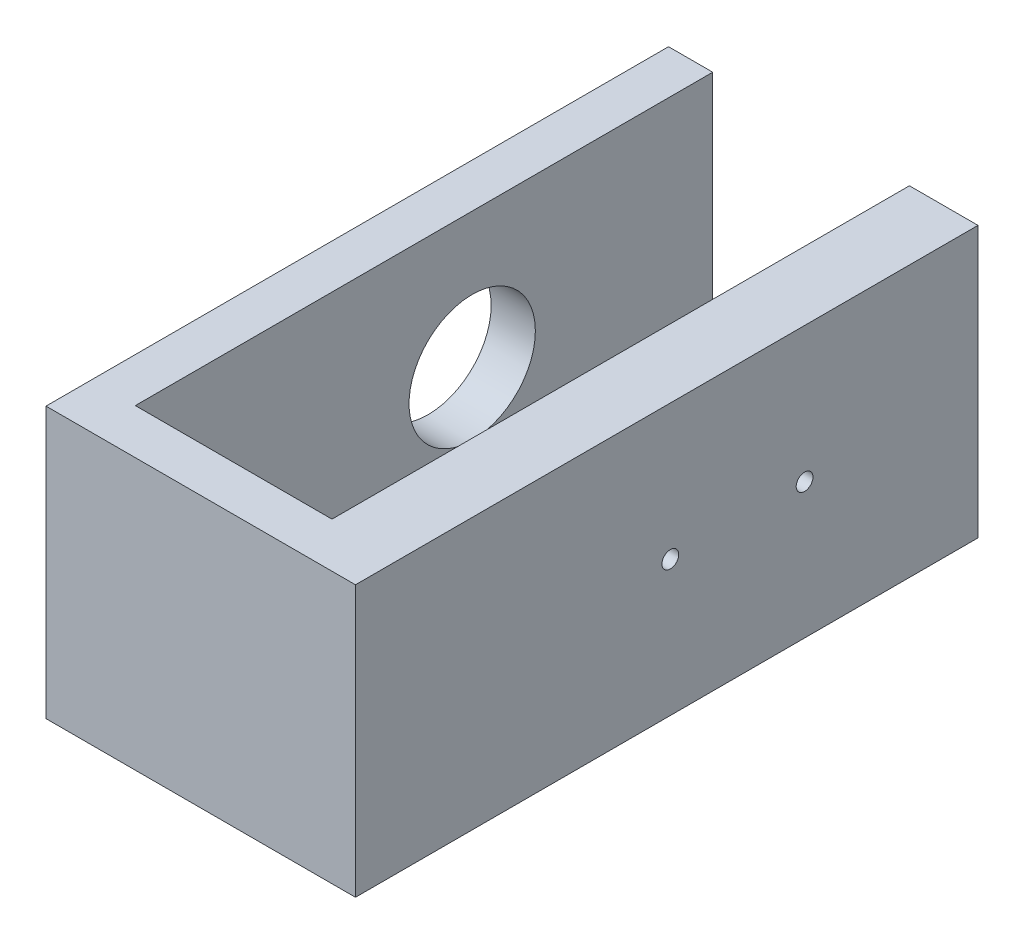
ISO-10303-21;
HEADER;
FILE_DESCRIPTION(('STEP AP214'),'2;1');
FILE_NAME('part.step','',(''),(''),'','','');
FILE_SCHEMA(('AUTOMOTIVE_DESIGN { 1 0 10303 214 1 1 1 1 }'));
ENDSEC;
DATA;
#1=APPLICATION_CONTEXT('core data for automotive mechanical design processes');
#2=APPLICATION_PROTOCOL_DEFINITION('international standard','automotive_design',2000,#1);
#3=PRODUCT_CONTEXT('',#1,'mechanical');
#4=PRODUCT('Part','Part','',(#3));
#5=PRODUCT_RELATED_PRODUCT_CATEGORY('part','',(#4));
#6=PRODUCT_DEFINITION_FORMATION('','',#4);
#7=PRODUCT_DEFINITION_CONTEXT('part definition',#1,'design');
#8=PRODUCT_DEFINITION('design','',#6,#7);
#9=PRODUCT_DEFINITION_SHAPE('','',#8);
#10=(LENGTH_UNIT() NAMED_UNIT(*) SI_UNIT(.MILLI.,.METRE.));
#11=(NAMED_UNIT(*) PLANE_ANGLE_UNIT() SI_UNIT($,.RADIAN.));
#12=(NAMED_UNIT(*) SI_UNIT($,.STERADIAN.) SOLID_ANGLE_UNIT());
#13=UNCERTAINTY_MEASURE_WITH_UNIT(LENGTH_MEASURE(1.E-05),#10,'distance_accuracy_value','');
#14=(GEOMETRIC_REPRESENTATION_CONTEXT(3) GLOBAL_UNCERTAINTY_ASSIGNED_CONTEXT((#13)) GLOBAL_UNIT_ASSIGNED_CONTEXT((#10,
#11,#12)) REPRESENTATION_CONTEXT('',''));
#15=CARTESIAN_POINT('',(0.,0.,0.));
#16=DIRECTION('',(0.,0.,1.));
#17=DIRECTION('',(1.,0.,0.));
#18=AXIS2_PLACEMENT_3D('',#15,#16,#17);
#19=CARTESIAN_POINT('',(-20.,15.,-48.34));
#20=DIRECTION('',(1.,0.,0.));
#21=DIRECTION('',(0.,0.,-1.));
#22=AXIS2_PLACEMENT_3D('',#19,#20,#21);
#23=CYLINDRICAL_SURFACE('',#22,7.);
#24=CARTESIAN_POINT('',(41.6,15.,-48.34));
#25=DIRECTION('',(1.,0.,0.));
#26=DIRECTION('',(0.,0.,-1.));
#27=AXIS2_PLACEMENT_3D('',#24,#25,#26);
#28=CIRCLE('',#27,7.);
#29=CARTESIAN_POINT('',(41.6,15.,-55.34));
#30=VERTEX_POINT('',#29);
#31=EDGE_CURVE('E196',#30,#30,#28,.T.);
#32=ORIENTED_EDGE('',*,*,#31,.F.);
#33=EDGE_LOOP('',(#32));
#34=FACE_BOUND('',#33,.T.);
#35=CARTESIAN_POINT('',(45.2,15.,-48.34));
#36=DIRECTION('',(1.,0.,0.));
#37=DIRECTION('',(0.,0.,-1.));
#38=AXIS2_PLACEMENT_3D('',#35,#36,#37);
#39=CIRCLE('',#38,7.);
#40=CARTESIAN_POINT('',(45.2,14.2065492031291,-55.2948857526882));
#41=VERTEX_POINT('',#40);
#42=CARTESIAN_POINT('',(45.2,15.7934507968709,-55.2948857526882));
#43=VERTEX_POINT('',#42);
#44=EDGE_CURVE('E149',#41,#43,#39,.T.);
#45=ORIENTED_EDGE('',*,*,#44,.T.);
#46=DIRECTION('',(-1.,0.,0.));
#47=VECTOR('',#46,1.);
#48=CARTESIAN_POINT('',(45.2,15.7934507968709,-55.2948857526882));
#49=LINE('',#48,#47);
#50=CARTESIAN_POINT('',(45.4,15.7934507968709,-55.2948857526882));
#51=VERTEX_POINT('',#50);
#52=EDGE_CURVE('E139',#51,#43,#49,.T.);
#53=ORIENTED_EDGE('',*,*,#52,.F.);
#54=CARTESIAN_POINT('',(45.4,15.,-48.34));
#55=DIRECTION('',(-1.,0.,0.));
#56=DIRECTION('',(0.,0.,1.));
#57=AXIS2_PLACEMENT_3D('',#54,#55,#56);
#58=CIRCLE('',#57,7.);
#59=CARTESIAN_POINT('',(45.4,15.793450796871,-41.3851142473118));
#60=VERTEX_POINT('',#59);
#61=EDGE_CURVE('E133',#60,#51,#58,.T.);
#62=ORIENTED_EDGE('',*,*,#61,.F.);
#63=DIRECTION('',(-1.,0.,0.));
#64=VECTOR('',#63,1.);
#65=CARTESIAN_POINT('',(45.2,15.793450796871,-41.3851142473118));
#66=LINE('',#65,#64);
#67=CARTESIAN_POINT('',(45.2,15.793450796871,-41.3851142473118));
#68=VERTEX_POINT('',#67);
#69=EDGE_CURVE('E64',#68,#60,#66,.F.);
#70=ORIENTED_EDGE('',*,*,#69,.F.);
#71=CARTESIAN_POINT('',(45.2,15.,-48.34));
#72=DIRECTION('',(1.,0.,0.));
#73=DIRECTION('',(0.,0.,-1.));
#74=AXIS2_PLACEMENT_3D('',#71,#72,#73);
#75=CIRCLE('',#74,7.);
#76=CARTESIAN_POINT('',(45.2,14.2065492031291,-41.3851142473118));
#77=VERTEX_POINT('',#76);
#78=EDGE_CURVE('E50',#68,#77,#75,.T.);
#79=ORIENTED_EDGE('',*,*,#78,.T.);
#80=DIRECTION('',(-1.,0.,0.));
#81=VECTOR('',#80,1.);
#82=CARTESIAN_POINT('',(45.2,14.2065492031291,-41.3851142473118));
#83=LINE('',#82,#81);
#84=CARTESIAN_POINT('',(45.4,14.2065492031291,-41.3851142473118));
#85=VERTEX_POINT('',#84);
#86=EDGE_CURVE('E141',#85,#77,#83,.T.);
#87=ORIENTED_EDGE('',*,*,#86,.F.);
#88=CARTESIAN_POINT('',(45.4,14.2065492031291,-55.2948857526882));
#89=VERTEX_POINT('',#88);
#90=EDGE_CURVE('E135',#89,#85,#58,.T.);
#91=ORIENTED_EDGE('',*,*,#90,.F.);
#92=DIRECTION('',(-1.,0.,0.));
#93=VECTOR('',#92,1.);
#94=CARTESIAN_POINT('',(45.2,14.2065492031291,-55.2948857526882));
#95=LINE('',#94,#93);
#96=EDGE_CURVE('E57',#41,#89,#95,.F.);
#97=ORIENTED_EDGE('',*,*,#96,.F.);
#98=EDGE_LOOP('',(#45,#53,#62,#70,#79,#87,#91,#97));
#99=FACE_BOUND('',#98,.T.);
#100=ADVANCED_FACE('F41',(#34,#99),#23,.F.);
#101=CARTESIAN_POINT('',(0.,30.,0.));
#102=DIRECTION('',(0.,1.,0.));
#103=DIRECTION('',(0.,0.,1.));
#104=AXIS2_PLACEMENT_3D('',#101,#102,#103);
#105=PLANE('',#104);
#106=DIRECTION('',(1.,0.,0.));
#107=VECTOR('',#106,1.);
#108=CARTESIAN_POINT('',(0.,30.,-75.));
#109=LINE('',#108,#107);
#110=CARTESIAN_POINT('',(14.9,30.,-75.));
#111=VERTEX_POINT('',#110);
#112=CARTESIAN_POINT('',(19.8,30.,-75.));
#113=VERTEX_POINT('',#112);
#114=EDGE_CURVE('E186',#111,#113,#109,.T.);
#115=ORIENTED_EDGE('',*,*,#114,.F.);
#116=DIRECTION('',(0.,0.,1.));
#117=VECTOR('',#116,1.);
#118=CARTESIAN_POINT('',(14.9,30.,0.));
#119=LINE('',#118,#117);
#120=CARTESIAN_POINT('',(14.9,30.,-6.));
#121=VERTEX_POINT('',#120);
#122=EDGE_CURVE('E261',#111,#121,#119,.T.);
#123=ORIENTED_EDGE('',*,*,#122,.T.);
#124=DIRECTION('',(1.,0.,0.));
#125=VECTOR('',#124,1.);
#126=CARTESIAN_POINT('',(0.,30.,-6.));
#127=LINE('',#126,#125);
#128=CARTESIAN_POINT('',(49.2,30.,-6.));
#129=VERTEX_POINT('',#128);
#130=EDGE_CURVE('E207',#121,#129,#127,.T.);
#131=ORIENTED_EDGE('',*,*,#130,.T.);
#132=DIRECTION('',(0.,0.,-1.));
#133=VECTOR('',#132,1.);
#134=CARTESIAN_POINT('',(49.2,30.,0.));
#135=LINE('',#134,#133);
#136=CARTESIAN_POINT('',(49.2,30.,-75.));
#137=VERTEX_POINT('',#136);
#138=EDGE_CURVE('E204',#129,#137,#135,.T.);
#139=ORIENTED_EDGE('',*,*,#138,.T.);
#140=DIRECTION('',(-1.,0.,0.));
#141=VECTOR('',#140,1.);
#142=CARTESIAN_POINT('',(0.,30.,-75.));
#143=LINE('',#142,#141);
#144=CARTESIAN_POINT('',(41.6,30.,-75.));
#145=VERTEX_POINT('',#144);
#146=EDGE_CURVE('E192',#137,#145,#143,.T.);
#147=ORIENTED_EDGE('',*,*,#146,.T.);
#148=DIRECTION('',(0.,0.,-1.));
#149=VECTOR('',#148,1.);
#150=CARTESIAN_POINT('',(41.6,30.,-75.));
#151=LINE('',#150,#149);
#152=CARTESIAN_POINT('',(41.6,30.,-11.));
#153=VERTEX_POINT('',#152);
#154=EDGE_CURVE('E215',#153,#145,#151,.T.);
#155=ORIENTED_EDGE('',*,*,#154,.F.);
#156=DIRECTION('',(1.,0.,0.));
#157=VECTOR('',#156,1.);
#158=CARTESIAN_POINT('',(41.6,30.,-11.));
#159=LINE('',#158,#157);
#160=CARTESIAN_POINT('',(19.8,30.,-11.));
#161=VERTEX_POINT('',#160);
#162=EDGE_CURVE('E230',#161,#153,#159,.T.);
#163=ORIENTED_EDGE('',*,*,#162,.F.);
#164=DIRECTION('',(0.,0.,1.));
#165=VECTOR('',#164,1.);
#166=CARTESIAN_POINT('',(19.8,30.,-75.));
#167=LINE('',#166,#165);
#168=EDGE_CURVE('E251',#113,#161,#167,.T.);
#169=ORIENTED_EDGE('',*,*,#168,.F.);
#170=EDGE_LOOP('',(#115,#123,#131,#139,#147,#155,#163,#169));
#171=FACE_BOUND('',#170,.T.);
#172=ADVANCED_FACE('F43',(#171),#105,.T.);
#173=CARTESIAN_POINT('',(0.,0.,0.));
#174=DIRECTION('',(0.,1.,0.));
#175=DIRECTION('',(0.,0.,1.));
#176=AXIS2_PLACEMENT_3D('',#173,#174,#175);
#177=PLANE('',#176);
#178=DIRECTION('',(0.,0.,1.));
#179=VECTOR('',#178,1.);
#180=CARTESIAN_POINT('',(14.9,0.,0.));
#181=LINE('',#180,#179);
#182=CARTESIAN_POINT('',(14.9,0.,-75.));
#183=VERTEX_POINT('',#182);
#184=CARTESIAN_POINT('',(14.9,0.,-6.));
#185=VERTEX_POINT('',#184);
#186=EDGE_CURVE('E246',#183,#185,#181,.T.);
#187=ORIENTED_EDGE('',*,*,#186,.F.);
#188=DIRECTION('',(1.,0.,0.));
#189=VECTOR('',#188,1.);
#190=CARTESIAN_POINT('',(0.,0.,-75.));
#191=LINE('',#190,#189);
#192=CARTESIAN_POINT('',(19.8,0.,-75.));
#193=VERTEX_POINT('',#192);
#194=EDGE_CURVE('E188',#183,#193,#191,.T.);
#195=ORIENTED_EDGE('',*,*,#194,.T.);
#196=DIRECTION('',(0.,0.,-1.));
#197=VECTOR('',#196,1.);
#198=CARTESIAN_POINT('',(19.8,0.,-75.));
#199=LINE('',#198,#197);
#200=CARTESIAN_POINT('',(19.8,0.,-11.));
#201=VERTEX_POINT('',#200);
#202=EDGE_CURVE('E242',#201,#193,#199,.T.);
#203=ORIENTED_EDGE('',*,*,#202,.F.);
#204=DIRECTION('',(-1.,0.,0.));
#205=VECTOR('',#204,1.);
#206=CARTESIAN_POINT('',(41.6,0.,-11.));
#207=LINE('',#206,#205);
#208=CARTESIAN_POINT('',(41.6,0.,-11.));
#209=VERTEX_POINT('',#208);
#210=EDGE_CURVE('E200',#209,#201,#207,.T.);
#211=ORIENTED_EDGE('',*,*,#210,.F.);
#212=DIRECTION('',(0.,0.,1.));
#213=VECTOR('',#212,1.);
#214=CARTESIAN_POINT('',(41.6,0.,-75.));
#215=LINE('',#214,#213);
#216=CARTESIAN_POINT('',(41.6,0.,-75.));
#217=VERTEX_POINT('',#216);
#218=EDGE_CURVE('E219',#217,#209,#215,.T.);
#219=ORIENTED_EDGE('',*,*,#218,.F.);
#220=DIRECTION('',(-1.,0.,0.));
#221=VECTOR('',#220,1.);
#222=CARTESIAN_POINT('',(0.,0.,-75.));
#223=LINE('',#222,#221);
#224=CARTESIAN_POINT('',(49.2,0.,-75.));
#225=VERTEX_POINT('',#224);
#226=EDGE_CURVE('E193',#225,#217,#223,.T.);
#227=ORIENTED_EDGE('',*,*,#226,.F.);
#228=DIRECTION('',(0.,0.,-1.));
#229=VECTOR('',#228,1.);
#230=CARTESIAN_POINT('',(49.2,0.,0.));
#231=LINE('',#230,#229);
#232=CARTESIAN_POINT('',(49.2,0.,-6.));
#233=VERTEX_POINT('',#232);
#234=EDGE_CURVE('E211',#233,#225,#231,.T.);
#235=ORIENTED_EDGE('',*,*,#234,.F.);
#236=DIRECTION('',(1.,0.,0.));
#237=VECTOR('',#236,1.);
#238=CARTESIAN_POINT('',(0.,0.,-6.));
#239=LINE('',#238,#237);
#240=EDGE_CURVE('E187',#185,#233,#239,.T.);
#241=ORIENTED_EDGE('',*,*,#240,.F.);
#242=EDGE_LOOP('',(#187,#195,#203,#211,#219,#227,#235,#241));
#243=FACE_BOUND('',#242,.T.);
#244=ADVANCED_FACE('F292',(#243),#177,.F.);
#245=CARTESIAN_POINT('',(0.,0.,-6.));
#246=DIRECTION('',(0.,0.,1.));
#247=DIRECTION('',(1.,0.,0.));
#248=AXIS2_PLACEMENT_3D('',#245,#246,#247);
#249=PLANE('',#248);
#250=ORIENTED_EDGE('',*,*,#130,.F.);
#251=DIRECTION('',(0.,-1.,0.));
#252=VECTOR('',#251,1.);
#253=CARTESIAN_POINT('',(14.9,0.,-6.));
#254=LINE('',#253,#252);
#255=EDGE_CURVE('E191',#121,#185,#254,.T.);
#256=ORIENTED_EDGE('',*,*,#255,.T.);
#257=ORIENTED_EDGE('',*,*,#240,.T.);
#258=DIRECTION('',(0.,-1.,0.));
#259=VECTOR('',#258,1.);
#260=CARTESIAN_POINT('',(49.2,0.,-6.));
#261=LINE('',#260,#259);
#262=EDGE_CURVE('E214',#129,#233,#261,.T.);
#263=ORIENTED_EDGE('',*,*,#262,.F.);
#264=EDGE_LOOP('',(#250,#256,#257,#263));
#265=FACE_BOUND('',#264,.T.);
#266=ADVANCED_FACE('F321',(#265),#249,.T.);
#267=CARTESIAN_POINT('',(0.,30.,-75.));
#268=DIRECTION('',(0.,0.,-1.));
#269=DIRECTION('',(-1.,0.,0.));
#270=AXIS2_PLACEMENT_3D('',#267,#268,#269);
#271=PLANE('',#270);
#272=ORIENTED_EDGE('',*,*,#194,.F.);
#273=DIRECTION('',(0.,1.,0.));
#274=VECTOR('',#273,1.);
#275=CARTESIAN_POINT('',(14.9,30.,-75.));
#276=LINE('',#275,#274);
#277=EDGE_CURVE('E182',#183,#111,#276,.T.);
#278=ORIENTED_EDGE('',*,*,#277,.T.);
#279=ORIENTED_EDGE('',*,*,#114,.T.);
#280=DIRECTION('',(0.,1.,0.));
#281=VECTOR('',#280,1.);
#282=CARTESIAN_POINT('',(19.8,30.,-75.));
#283=LINE('',#282,#281);
#284=EDGE_CURVE('E226',#193,#113,#283,.T.);
#285=ORIENTED_EDGE('',*,*,#284,.F.);
#286=EDGE_LOOP('',(#272,#278,#279,#285));
#287=FACE_BOUND('',#286,.T.);
#288=ADVANCED_FACE('F297',(#287),#271,.T.);
#289=CARTESIAN_POINT('',(0.,0.,-11.));
#290=DIRECTION('',(0.,0.,-1.));
#291=DIRECTION('',(-1.,0.,0.));
#292=AXIS2_PLACEMENT_3D('',#289,#290,#291);
#293=PLANE('',#292);
#294=ORIENTED_EDGE('',*,*,#210,.T.);
#295=DIRECTION('',(0.,-1.,0.));
#296=VECTOR('',#295,1.);
#297=CARTESIAN_POINT('',(19.8,30.,-11.));
#298=LINE('',#297,#296);
#299=EDGE_CURVE('E247',#161,#201,#298,.T.);
#300=ORIENTED_EDGE('',*,*,#299,.F.);
#301=ORIENTED_EDGE('',*,*,#162,.T.);
#302=DIRECTION('',(0.,-1.,0.));
#303=VECTOR('',#302,1.);
#304=CARTESIAN_POINT('',(41.6,30.,-11.));
#305=LINE('',#304,#303);
#306=EDGE_CURVE('E233',#153,#209,#305,.T.);
#307=ORIENTED_EDGE('',*,*,#306,.T.);
#308=EDGE_LOOP('',(#294,#300,#301,#307));
#309=FACE_BOUND('',#308,.T.);
#310=ADVANCED_FACE('F303',(#309),#293,.T.);
#311=CARTESIAN_POINT('',(49.2,0.,0.));
#312=DIRECTION('',(1.,0.,0.));
#313=DIRECTION('',(0.,0.,-1.));
#314=AXIS2_PLACEMENT_3D('',#311,#312,#313);
#315=PLANE('',#314);
#316=CARTESIAN_POINT('',(49.2,15.0000000000001,-40.9));
#317=DIRECTION('',(1.,0.,0.));
#318=DIRECTION('',(0.,0.,-1.));
#319=AXIS2_PLACEMENT_3D('',#316,#317,#318);
#320=CIRCLE('',#319,0.929999999999999);
#321=CARTESIAN_POINT('',(49.2,15.0000000000001,-41.83));
#322=VERTEX_POINT('',#321);
#323=EDGE_CURVE('E163',#322,#322,#320,.T.);
#324=ORIENTED_EDGE('',*,*,#323,.F.);
#325=EDGE_LOOP('',(#324));
#326=FACE_BOUND('',#325,.T.);
#327=CARTESIAN_POINT('',(49.2,15.,-55.78));
#328=DIRECTION('',(1.,0.,0.));
#329=DIRECTION('',(0.,0.,-1.));
#330=AXIS2_PLACEMENT_3D('',#327,#328,#329);
#331=CIRCLE('',#330,0.93);
#332=CARTESIAN_POINT('',(49.2,15.,-56.71));
#333=VERTEX_POINT('',#332);
#334=EDGE_CURVE('E166',#333,#333,#331,.T.);
#335=ORIENTED_EDGE('',*,*,#334,.F.);
#336=EDGE_LOOP('',(#335));
#337=FACE_BOUND('',#336,.T.);
#338=ORIENTED_EDGE('',*,*,#138,.F.);
#339=ORIENTED_EDGE('',*,*,#262,.T.);
#340=ORIENTED_EDGE('',*,*,#234,.T.);
#341=DIRECTION('',(0.,1.,0.));
#342=VECTOR('',#341,1.);
#343=CARTESIAN_POINT('',(49.2,30.,-75.));
#344=LINE('',#343,#342);
#345=EDGE_CURVE('E197',#225,#137,#344,.T.);
#346=ORIENTED_EDGE('',*,*,#345,.T.);
#347=EDGE_LOOP('',(#338,#339,#340,#346));
#348=FACE_BOUND('',#347,.T.);
#349=ADVANCED_FACE('F299',(#326,#337,#348),#315,.T.);
#350=CARTESIAN_POINT('',(0.,30.,-75.));
#351=DIRECTION('',(0.,0.,1.));
#352=DIRECTION('',(1.,0.,0.));
#353=AXIS2_PLACEMENT_3D('',#350,#351,#352);
#354=PLANE('',#353);
#355=ORIENTED_EDGE('',*,*,#345,.F.);
#356=ORIENTED_EDGE('',*,*,#226,.T.);
#357=DIRECTION('',(0.,-1.,0.));
#358=VECTOR('',#357,1.);
#359=CARTESIAN_POINT('',(41.6,0.,-75.));
#360=LINE('',#359,#358);
#361=EDGE_CURVE('E218',#145,#217,#360,.T.);
#362=ORIENTED_EDGE('',*,*,#361,.F.);
#363=ORIENTED_EDGE('',*,*,#146,.F.);
#364=EDGE_LOOP('',(#355,#356,#362,#363));
#365=FACE_BOUND('',#364,.T.);
#366=ADVANCED_FACE('F302',(#365),#354,.F.);
#367=CARTESIAN_POINT('',(41.6,0.,0.));
#368=DIRECTION('',(1.,0.,0.));
#369=DIRECTION('',(0.,0.,-1.));
#370=AXIS2_PLACEMENT_3D('',#367,#368,#369);
#371=PLANE('',#370);
#372=ORIENTED_EDGE('',*,*,#31,.T.);
#373=EDGE_LOOP('',(#372));
#374=FACE_BOUND('',#373,.T.);
#375=ORIENTED_EDGE('',*,*,#218,.T.);
#376=ORIENTED_EDGE('',*,*,#306,.F.);
#377=ORIENTED_EDGE('',*,*,#154,.T.);
#378=ORIENTED_EDGE('',*,*,#361,.T.);
#379=EDGE_LOOP('',(#375,#376,#377,#378));
#380=FACE_BOUND('',#379,.T.);
#381=ADVANCED_FACE('F305',(#374,#380),#371,.F.);
#382=CARTESIAN_POINT('',(19.8,0.,0.));
#383=DIRECTION('',(-1.,0.,0.));
#384=DIRECTION('',(0.,0.,1.));
#385=AXIS2_PLACEMENT_3D('',#382,#383,#384);
#386=PLANE('',#385);
#387=CARTESIAN_POINT('',(19.8,15.,-48.34));
#388=DIRECTION('',(1.,0.,0.));
#389=DIRECTION('',(0.,0.,-1.));
#390=AXIS2_PLACEMENT_3D('',#387,#388,#389);
#391=CIRCLE('',#390,7.);
#392=CARTESIAN_POINT('',(19.8,15.,-55.34));
#393=VERTEX_POINT('',#392);
#394=EDGE_CURVE('E174',#393,#393,#391,.T.);
#395=ORIENTED_EDGE('',*,*,#394,.F.);
#396=EDGE_LOOP('',(#395));
#397=FACE_BOUND('',#396,.T.);
#398=ORIENTED_EDGE('',*,*,#284,.T.);
#399=ORIENTED_EDGE('',*,*,#168,.T.);
#400=ORIENTED_EDGE('',*,*,#299,.T.);
#401=ORIENTED_EDGE('',*,*,#202,.T.);
#402=EDGE_LOOP('',(#398,#399,#400,#401));
#403=FACE_BOUND('',#402,.T.);
#404=ADVANCED_FACE('F308',(#397,#403),#386,.F.);
#405=CARTESIAN_POINT('',(14.9,0.,0.));
#406=DIRECTION('',(-1.,0.,0.));
#407=DIRECTION('',(0.,0.,1.));
#408=AXIS2_PLACEMENT_3D('',#405,#406,#407);
#409=PLANE('',#408);
#410=CARTESIAN_POINT('',(14.9,15.,-48.34));
#411=DIRECTION('',(-1.,0.,0.));
#412=DIRECTION('',(0.,0.,1.));
#413=AXIS2_PLACEMENT_3D('',#410,#411,#412);
#414=CIRCLE('',#413,7.);
#415=CARTESIAN_POINT('',(14.9,15.,-41.34));
#416=VERTEX_POINT('',#415);
#417=EDGE_CURVE('E181',#416,#416,#414,.T.);
#418=ORIENTED_EDGE('',*,*,#417,.F.);
#419=EDGE_LOOP('',(#418));
#420=FACE_BOUND('',#419,.T.);
#421=ORIENTED_EDGE('',*,*,#122,.F.);
#422=ORIENTED_EDGE('',*,*,#277,.F.);
#423=ORIENTED_EDGE('',*,*,#186,.T.);
#424=ORIENTED_EDGE('',*,*,#255,.F.);
#425=EDGE_LOOP('',(#421,#422,#423,#424));
#426=FACE_BOUND('',#425,.T.);
#427=ADVANCED_FACE('F315',(#420,#426),#409,.T.);
#428=CARTESIAN_POINT('',(-14.25,15.,-48.34));
#429=DIRECTION('',(1.,0.,0.));
#430=DIRECTION('',(0.,0.,-1.));
#431=AXIS2_PLACEMENT_3D('',#428,#429,#430);
#432=CYLINDRICAL_SURFACE('',#431,7.);
#433=ORIENTED_EDGE('',*,*,#417,.T.);
#434=EDGE_LOOP('',(#433));
#435=FACE_BOUND('',#434,.T.);
#436=ORIENTED_EDGE('',*,*,#394,.T.);
#437=EDGE_LOOP('',(#436));
#438=FACE_BOUND('',#437,.T.);
#439=ADVANCED_FACE('F319',(#435,#438),#432,.F.);
#440=CARTESIAN_POINT('',(45.2,15.,-55.78));
#441=DIRECTION('',(1.,0.,0.));
#442=DIRECTION('',(0.,0.,-1.));
#443=AXIS2_PLACEMENT_3D('',#440,#441,#442);
#444=CYLINDRICAL_SURFACE('',#443,0.93);
#445=CARTESIAN_POINT('',(45.2,15.,-55.78));
#446=DIRECTION('',(1.,0.,0.));
#447=DIRECTION('',(0.,0.,-1.));
#448=AXIS2_PLACEMENT_3D('',#445,#446,#447);
#449=CIRCLE('',#448,0.93);
#450=EDGE_CURVE('E170',#41,#43,#449,.T.);
#451=ORIENTED_EDGE('',*,*,#450,.F.);
#452=ORIENTED_EDGE('',*,*,#96,.T.);
#453=CARTESIAN_POINT('',(45.4,15.,-55.78));
#454=DIRECTION('',(-1.,0.,0.));
#455=DIRECTION('',(0.,0.,1.));
#456=AXIS2_PLACEMENT_3D('',#453,#454,#455);
#457=CIRCLE('',#456,0.93);
#458=EDGE_CURVE('E160',#51,#89,#457,.F.);
#459=ORIENTED_EDGE('',*,*,#458,.F.);
#460=ORIENTED_EDGE('',*,*,#52,.T.);
#461=EDGE_LOOP('',(#451,#452,#459,#460));
#462=FACE_BOUND('',#461,.T.);
#463=ORIENTED_EDGE('',*,*,#334,.T.);
#464=EDGE_LOOP('',(#463));
#465=FACE_BOUND('',#464,.T.);
#466=ADVANCED_FACE('F360',(#462,#465),#444,.F.);
#467=CARTESIAN_POINT('',(45.2,15.,-55.78));
#468=DIRECTION('',(1.,0.,0.));
#469=DIRECTION('',(0.,0.,-1.));
#470=AXIS2_PLACEMENT_3D('',#467,#468,#469);
#471=PLANE('',#470);
#472=ORIENTED_EDGE('',*,*,#44,.F.);
#473=ORIENTED_EDGE('',*,*,#450,.T.);
#474=EDGE_LOOP('',(#472,#473));
#475=FACE_BOUND('',#474,.T.);
#476=ADVANCED_FACE('F283',(#475),#471,.T.);
#477=CARTESIAN_POINT('',(45.2,15.0000000000001,-40.9));
#478=DIRECTION('',(1.,0.,0.));
#479=DIRECTION('',(0.,0.,-1.));
#480=AXIS2_PLACEMENT_3D('',#477,#478,#479);
#481=CYLINDRICAL_SURFACE('',#480,0.929999999999999);
#482=CARTESIAN_POINT('',(45.2,15.0000000000001,-40.9));
#483=DIRECTION('',(1.,0.,0.));
#484=DIRECTION('',(0.,0.,-1.));
#485=AXIS2_PLACEMENT_3D('',#482,#483,#484);
#486=CIRCLE('',#485,0.929999999999999);
#487=EDGE_CURVE('E147',#68,#77,#486,.T.);
#488=ORIENTED_EDGE('',*,*,#487,.F.);
#489=ORIENTED_EDGE('',*,*,#69,.T.);
#490=CARTESIAN_POINT('',(45.4,15.0000000000001,-40.9));
#491=DIRECTION('',(-1.,0.,0.));
#492=DIRECTION('',(0.,0.,1.));
#493=AXIS2_PLACEMENT_3D('',#490,#491,#492);
#494=CIRCLE('',#493,0.929999999999999);
#495=EDGE_CURVE('E11',#85,#60,#494,.F.);
#496=ORIENTED_EDGE('',*,*,#495,.F.);
#497=ORIENTED_EDGE('',*,*,#86,.T.);
#498=EDGE_LOOP('',(#488,#489,#496,#497));
#499=FACE_BOUND('',#498,.T.);
#500=ORIENTED_EDGE('',*,*,#323,.T.);
#501=EDGE_LOOP('',(#500));
#502=FACE_BOUND('',#501,.T.);
#503=ADVANCED_FACE('F144',(#499,#502),#481,.F.);
#504=CARTESIAN_POINT('',(45.2,15.0000000000001,-40.9));
#505=DIRECTION('',(1.,0.,0.));
#506=DIRECTION('',(0.,0.,-1.));
#507=AXIS2_PLACEMENT_3D('',#504,#505,#506);
#508=PLANE('',#507);
#509=ORIENTED_EDGE('',*,*,#78,.F.);
#510=ORIENTED_EDGE('',*,*,#487,.T.);
#511=EDGE_LOOP('',(#509,#510));
#512=FACE_BOUND('',#511,.T.);
#513=ADVANCED_FACE('F275',(#512),#508,.T.);
#514=CARTESIAN_POINT('',(45.4,15.,-48.34));
#515=DIRECTION('',(-1.,0.,0.));
#516=DIRECTION('',(0.,0.,1.));
#517=AXIS2_PLACEMENT_3D('',#514,#515,#516);
#518=PLANE('',#517);
#519=ORIENTED_EDGE('',*,*,#458,.T.);
#520=ORIENTED_EDGE('',*,*,#90,.T.);
#521=ORIENTED_EDGE('',*,*,#495,.T.);
#522=ORIENTED_EDGE('',*,*,#61,.T.);
#523=EDGE_LOOP('',(#519,#520,#521,#522));
#524=FACE_BOUND('',#523,.T.);
#525=ADVANCED_FACE('F132',(#524),#518,.T.);
#526=CLOSED_SHELL('',(#100,#172,#244,#266,#288,#310,#349,#366,#381,#404,#427,#439,#466,#476,
#503,#513,#525));
#527=MANIFOLD_SOLID_BREP('B2',#526);
#528=ADVANCED_BREP_SHAPE_REPRESENTATION('',(#18,#527),#14);
#529=SHAPE_DEFINITION_REPRESENTATION(#9,#528);
ENDSEC;
END-ISO-10303-21;
